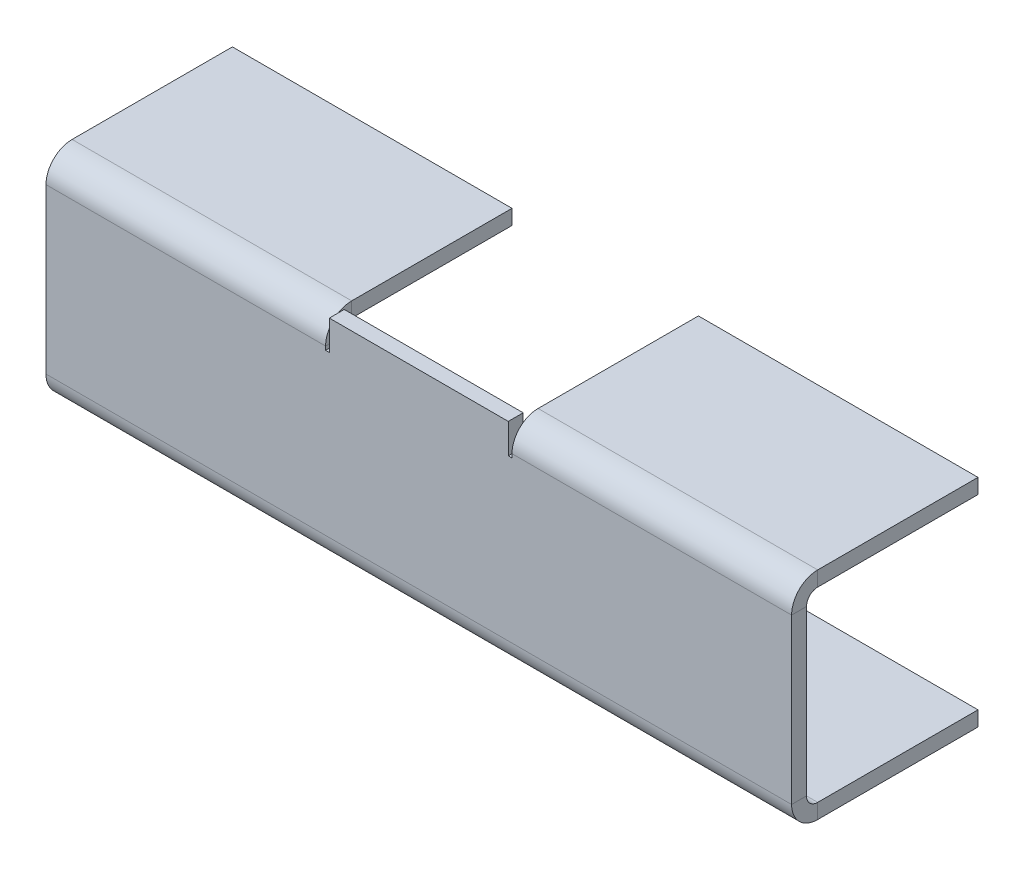
ISO-10303-21;
HEADER;
FILE_DESCRIPTION(('STEP AP214'),'2;1');
FILE_NAME('part.step','',(''),(''),'','','');
FILE_SCHEMA(('AUTOMOTIVE_DESIGN { 1 0 10303 214 1 1 1 1 }'));
ENDSEC;
DATA;
#1=APPLICATION_CONTEXT('core data for automotive mechanical design processes');
#2=APPLICATION_PROTOCOL_DEFINITION('international standard','automotive_design',2000,#1);
#3=PRODUCT_CONTEXT('',#1,'mechanical');
#4=PRODUCT('Part','Part','',(#3));
#5=PRODUCT_RELATED_PRODUCT_CATEGORY('part','',(#4));
#6=PRODUCT_DEFINITION_FORMATION('','',#4);
#7=PRODUCT_DEFINITION_CONTEXT('part definition',#1,'design');
#8=PRODUCT_DEFINITION('design','',#6,#7);
#9=PRODUCT_DEFINITION_SHAPE('','',#8);
#10=(LENGTH_UNIT() NAMED_UNIT(*) SI_UNIT(.MILLI.,.METRE.));
#11=(NAMED_UNIT(*) PLANE_ANGLE_UNIT() SI_UNIT($,.RADIAN.));
#12=(NAMED_UNIT(*) SI_UNIT($,.STERADIAN.) SOLID_ANGLE_UNIT());
#13=UNCERTAINTY_MEASURE_WITH_UNIT(LENGTH_MEASURE(1.E-05),#10,'distance_accuracy_value','');
#14=(GEOMETRIC_REPRESENTATION_CONTEXT(3) GLOBAL_UNCERTAINTY_ASSIGNED_CONTEXT((#13)) GLOBAL_UNIT_ASSIGNED_CONTEXT((#10,
#11,#12)) REPRESENTATION_CONTEXT('',''));
#15=CARTESIAN_POINT('',(0.,0.,0.));
#16=DIRECTION('',(0.,0.,1.));
#17=DIRECTION('',(1.,0.,0.));
#18=AXIS2_PLACEMENT_3D('',#15,#16,#17);
#19=CARTESIAN_POINT('',(0.,10.5,0.));
#20=DIRECTION('',(0.,1.,0.));
#21=DIRECTION('',(0.,0.,1.));
#22=AXIS2_PLACEMENT_3D('',#19,#20,#21);
#23=PLANE('',#22);
#24=DIRECTION('',(0.,0.,1.));
#25=VECTOR('',#24,1.);
#26=CARTESIAN_POINT('',(-12.,10.5,-2.));
#27=LINE('',#26,#25);
#28=CARTESIAN_POINT('',(-12.,10.5,-2.));
#29=VERTEX_POINT('',#28);
#30=CARTESIAN_POINT('',(-12.,10.5,0.));
#31=VERTEX_POINT('',#30);
#32=EDGE_CURVE('E60',#29,#31,#27,.T.);
#33=ORIENTED_EDGE('',*,*,#32,.F.);
#34=DIRECTION('',(1.,0.,0.));
#35=VECTOR('',#34,1.);
#36=CARTESIAN_POINT('',(0.,10.5,-2.));
#37=LINE('',#36,#35);
#38=CARTESIAN_POINT('',(-12.5,10.5,-2.));
#39=VERTEX_POINT('',#38);
#40=EDGE_CURVE('E274',#39,#29,#37,.T.);
#41=ORIENTED_EDGE('',*,*,#40,.F.);
#42=DIRECTION('',(0.,0.,1.));
#43=VECTOR('',#42,1.);
#44=CARTESIAN_POINT('',(-12.5,10.5000000000001,-25.));
#45=LINE('',#44,#43);
#46=CARTESIAN_POINT('',(-12.5,10.5,0.));
#47=VERTEX_POINT('',#46);
#48=EDGE_CURVE('E239',#39,#47,#45,.T.);
#49=ORIENTED_EDGE('',*,*,#48,.T.);
#50=DIRECTION('',(1.,0.,0.));
#51=VECTOR('',#50,1.);
#52=CARTESIAN_POINT('',(-12.5,10.5,0.));
#53=LINE('',#52,#51);
#54=EDGE_CURVE('E234',#47,#31,#53,.T.);
#55=ORIENTED_EDGE('',*,*,#54,.T.);
#56=EDGE_LOOP('',(#33,#41,#49,#55));
#57=FACE_BOUND('',#56,.T.);
#58=ADVANCED_FACE('F37',(#57),#23,.T.);
#59=CARTESIAN_POINT('',(12.5,10.5,0.));
#60=DIRECTION('',(1.,0.,0.));
#61=DIRECTION('',(0.,1.,0.));
#62=AXIS2_PLACEMENT_3D('',#59,#60,#61);
#63=PLANE('',#62);
#64=DIRECTION('',(0.,0.,1.));
#65=VECTOR('',#64,1.);
#66=CARTESIAN_POINT('',(12.5,12.5,0.));
#67=LINE('',#66,#65);
#68=CARTESIAN_POINT('',(12.5,12.5000000000001,-25.));
#69=VERTEX_POINT('',#68);
#70=CARTESIAN_POINT('',(12.5,12.5,-3.49999999999999));
#71=VERTEX_POINT('',#70);
#72=EDGE_CURVE('E249',#69,#71,#67,.T.);
#73=ORIENTED_EDGE('',*,*,#72,.T.);
#74=DIRECTION('',(0.,1.,0.));
#75=VECTOR('',#74,1.);
#76=CARTESIAN_POINT('',(12.5,12.5,-3.49999999999999));
#77=LINE('',#76,#75);
#78=CARTESIAN_POINT('',(12.5,14.5,-3.49999999999999));
#79=VERTEX_POINT('',#78);
#80=EDGE_CURVE('E11',#71,#79,#77,.T.);
#81=ORIENTED_EDGE('',*,*,#80,.T.);
#82=DIRECTION('',(0.,0.,-1.));
#83=VECTOR('',#82,1.);
#84=CARTESIAN_POINT('',(12.5,14.5,0.));
#85=LINE('',#84,#83);
#86=CARTESIAN_POINT('',(12.5,14.5000000000001,-25.));
#87=VERTEX_POINT('',#86);
#88=EDGE_CURVE('E231',#79,#87,#85,.T.);
#89=ORIENTED_EDGE('',*,*,#88,.T.);
#90=DIRECTION('',(0.,1.,0.));
#91=VECTOR('',#90,1.);
#92=CARTESIAN_POINT('',(12.5,14.5000000000001,-25.));
#93=LINE('',#92,#91);
#94=EDGE_CURVE('E399',#69,#87,#93,.T.);
#95=ORIENTED_EDGE('',*,*,#94,.F.);
#96=EDGE_LOOP('',(#73,#81,#89,#95));
#97=FACE_BOUND('',#96,.T.);
#98=ADVANCED_FACE('F496',(#97),#63,.F.);
#99=DIRECTION('',(0.,1.,0.));
#100=VECTOR('',#99,1.);
#101=CARTESIAN_POINT('',(12.5,10.5,0.));
#102=LINE('',#101,#100);
#103=CARTESIAN_POINT('',(12.5,10.5,0.));
#104=VERTEX_POINT('',#103);
#105=CARTESIAN_POINT('',(12.5,11.,0.));
#106=VERTEX_POINT('',#105);
#107=EDGE_CURVE('E241',#104,#106,#102,.T.);
#108=ORIENTED_EDGE('',*,*,#107,.T.);
#109=DIRECTION('',(0.,0.,-1.));
#110=VECTOR('',#109,1.);
#111=CARTESIAN_POINT('',(12.5,11.,0.));
#112=LINE('',#111,#110);
#113=CARTESIAN_POINT('',(12.5,11.,-2.00000000000001));
#114=VERTEX_POINT('',#113);
#115=EDGE_CURVE('E45',#106,#114,#112,.T.);
#116=ORIENTED_EDGE('',*,*,#115,.T.);
#117=DIRECTION('',(0.,-1.,0.));
#118=VECTOR('',#117,1.);
#119=CARTESIAN_POINT('',(12.5,0.,-2.));
#120=LINE('',#119,#118);
#121=CARTESIAN_POINT('',(12.5,10.5,-2.));
#122=VERTEX_POINT('',#121);
#123=EDGE_CURVE('E257',#114,#122,#120,.T.);
#124=ORIENTED_EDGE('',*,*,#123,.T.);
#125=DIRECTION('',(0.,0.,-1.));
#126=VECTOR('',#125,1.);
#127=CARTESIAN_POINT('',(12.5,10.5,0.));
#128=LINE('',#127,#126);
#129=EDGE_CURVE('E236',#104,#122,#128,.T.);
#130=ORIENTED_EDGE('',*,*,#129,.F.);
#131=EDGE_LOOP('',(#108,#116,#124,#130));
#132=FACE_BOUND('',#131,.T.);
#133=ADVANCED_FACE('F413',(#132),#63,.F.);
#134=CARTESIAN_POINT('',(-12.5,10.5000000000001,-25.));
#135=DIRECTION('',(-1.,0.,0.));
#136=DIRECTION('',(0.,-1.,0.));
#137=AXIS2_PLACEMENT_3D('',#134,#135,#136);
#138=PLANE('',#137);
#139=DIRECTION('',(0.,1.,0.));
#140=VECTOR('',#139,1.);
#141=CARTESIAN_POINT('',(-12.5,0.,-2.));
#142=LINE('',#141,#140);
#143=CARTESIAN_POINT('',(-12.5,11.,-2.00000000000001));
#144=VERTEX_POINT('',#143);
#145=EDGE_CURVE('E268',#39,#144,#142,.T.);
#146=ORIENTED_EDGE('',*,*,#145,.T.);
#147=DIRECTION('',(0.,0.,1.));
#148=VECTOR('',#147,1.);
#149=CARTESIAN_POINT('',(-12.5,11.,-2.00000000000001));
#150=LINE('',#149,#148);
#151=CARTESIAN_POINT('',(-12.5,11.,0.));
#152=VERTEX_POINT('',#151);
#153=EDGE_CURVE('E410',#144,#152,#150,.T.);
#154=ORIENTED_EDGE('',*,*,#153,.T.);
#155=DIRECTION('',(0.,1.,0.));
#156=VECTOR('',#155,1.);
#157=CARTESIAN_POINT('',(-12.5,10.5,0.));
#158=LINE('',#157,#156);
#159=EDGE_CURVE('E246',#47,#152,#158,.T.);
#160=ORIENTED_EDGE('',*,*,#159,.F.);
#161=ORIENTED_EDGE('',*,*,#48,.F.);
#162=EDGE_LOOP('',(#146,#154,#160,#161));
#163=FACE_BOUND('',#162,.T.);
#164=ADVANCED_FACE('F518',(#163),#138,.F.);
#165=DIRECTION('',(0.,0.,1.));
#166=VECTOR('',#165,1.);
#167=CARTESIAN_POINT('',(-12.5,14.5000000000001,-25.));
#168=LINE('',#167,#166);
#169=CARTESIAN_POINT('',(-12.5,14.5000000000001,-25.));
#170=VERTEX_POINT('',#169);
#171=CARTESIAN_POINT('',(-12.5,14.5,-3.49999999999999));
#172=VERTEX_POINT('',#171);
#173=EDGE_CURVE('E243',#170,#172,#168,.T.);
#174=ORIENTED_EDGE('',*,*,#173,.T.);
#175=DIRECTION('',(0.,-1.,0.));
#176=VECTOR('',#175,1.);
#177=CARTESIAN_POINT('',(-12.5,14.5,-3.49999999999999));
#178=LINE('',#177,#176);
#179=CARTESIAN_POINT('',(-12.5,12.5,-3.49999999999999));
#180=VERTEX_POINT('',#179);
#181=EDGE_CURVE('E408',#172,#180,#178,.T.);
#182=ORIENTED_EDGE('',*,*,#181,.T.);
#183=DIRECTION('',(0.,0.,-1.));
#184=VECTOR('',#183,1.);
#185=CARTESIAN_POINT('',(-12.5,12.5,0.));
#186=LINE('',#185,#184);
#187=CARTESIAN_POINT('',(-12.5,12.5000000000001,-25.));
#188=VERTEX_POINT('',#187);
#189=EDGE_CURVE('E263',#180,#188,#186,.T.);
#190=ORIENTED_EDGE('',*,*,#189,.T.);
#191=DIRECTION('',(0.,-1.,0.));
#192=VECTOR('',#191,1.);
#193=CARTESIAN_POINT('',(-12.5,14.5000000000001,-25.));
#194=LINE('',#193,#192);
#195=EDGE_CURVE('E405',#170,#188,#194,.T.);
#196=ORIENTED_EDGE('',*,*,#195,.F.);
#197=EDGE_LOOP('',(#174,#182,#190,#196));
#198=FACE_BOUND('',#197,.T.);
#199=ADVANCED_FACE('F548',(#198),#138,.F.);
#200=CARTESIAN_POINT('',(50.,11.,-3.5));
#201=DIRECTION('',(1.,0.,0.));
#202=DIRECTION('',(0.,1.,0.));
#203=AXIS2_PLACEMENT_3D('',#200,#201,#202);
#204=CYLINDRICAL_SURFACE('',#203,3.49999999999999);
#205=CARTESIAN_POINT('',(-12.5,11.,-3.5));
#206=DIRECTION('',(-1.,0.,0.));
#207=DIRECTION('',(0.,-1.,0.));
#208=AXIS2_PLACEMENT_3D('',#205,#206,#207);
#209=CIRCLE('',#208,3.49999999999999);
#210=EDGE_CURVE('E271',#172,#152,#209,.F.);
#211=ORIENTED_EDGE('',*,*,#210,.F.);
#212=DIRECTION('',(-1.,0.,0.));
#213=VECTOR('',#212,1.);
#214=CARTESIAN_POINT('',(0.,14.5,-3.49999999999999));
#215=LINE('',#214,#213);
#216=CARTESIAN_POINT('',(-50.,14.5,-3.49999999999999));
#217=VERTEX_POINT('',#216);
#218=EDGE_CURVE('E337',#172,#217,#215,.T.);
#219=ORIENTED_EDGE('',*,*,#218,.T.);
#220=CARTESIAN_POINT('',(-50.,11.,-3.5));
#221=DIRECTION('',(1.,0.,0.));
#222=DIRECTION('',(0.,0.,-1.));
#223=AXIS2_PLACEMENT_3D('',#220,#221,#222);
#224=CIRCLE('',#223,3.49999999999999);
#225=CARTESIAN_POINT('',(-50.,11.,0.));
#226=VERTEX_POINT('',#225);
#227=EDGE_CURVE('E371',#226,#217,#224,.F.);
#228=ORIENTED_EDGE('',*,*,#227,.F.);
#229=DIRECTION('',(1.,0.,0.));
#230=VECTOR('',#229,1.);
#231=CARTESIAN_POINT('',(50.,11.,0.));
#232=LINE('',#231,#230);
#233=EDGE_CURVE('E372',#152,#226,#232,.F.);
#234=ORIENTED_EDGE('',*,*,#233,.F.);
#235=EDGE_LOOP('',(#211,#219,#228,#234));
#236=FACE_BOUND('',#235,.T.);
#237=ADVANCED_FACE('F524',(#236),#204,.T.);
#238=CARTESIAN_POINT('',(50.,11.,-3.5));
#239=DIRECTION('',(1.,0.,0.));
#240=DIRECTION('',(0.,1.,0.));
#241=AXIS2_PLACEMENT_3D('',#238,#239,#240);
#242=CYLINDRICAL_SURFACE('',#241,1.49999999999999);
#243=DIRECTION('',(1.,0.,0.));
#244=VECTOR('',#243,1.);
#245=CARTESIAN_POINT('',(-50.,12.5,-3.49999999999999));
#246=LINE('',#245,#244);
#247=CARTESIAN_POINT('',(-50.,12.5,-3.49999999999999));
#248=VERTEX_POINT('',#247);
#249=EDGE_CURVE('E330',#248,#180,#246,.T.);
#250=ORIENTED_EDGE('',*,*,#249,.T.);
#251=CARTESIAN_POINT('',(-12.5,11.,-3.5));
#252=DIRECTION('',(-1.,0.,0.));
#253=DIRECTION('',(0.,-1.,0.));
#254=AXIS2_PLACEMENT_3D('',#251,#252,#253);
#255=CIRCLE('',#254,1.49999999999999);
#256=EDGE_CURVE('E265',#180,#144,#255,.F.);
#257=ORIENTED_EDGE('',*,*,#256,.T.);
#258=DIRECTION('',(1.,0.,0.));
#259=VECTOR('',#258,1.);
#260=CARTESIAN_POINT('',(50.,11.,-2.00000000000001));
#261=LINE('',#260,#259);
#262=CARTESIAN_POINT('',(-50.,11.,-2.));
#263=VERTEX_POINT('',#262);
#264=EDGE_CURVE('E385',#144,#263,#261,.F.);
#265=ORIENTED_EDGE('',*,*,#264,.T.);
#266=CARTESIAN_POINT('',(-50.,11.,-3.5));
#267=DIRECTION('',(1.,0.,0.));
#268=DIRECTION('',(0.,0.,-1.));
#269=AXIS2_PLACEMENT_3D('',#266,#267,#268);
#270=CIRCLE('',#269,1.49999999999999);
#271=EDGE_CURVE('E379',#263,#248,#270,.F.);
#272=ORIENTED_EDGE('',*,*,#271,.T.);
#273=EDGE_LOOP('',(#250,#257,#265,#272));
#274=FACE_BOUND('',#273,.T.);
#275=ADVANCED_FACE('F540',(#274),#242,.F.);
#276=CARTESIAN_POINT('',(0.,14.5,0.));
#277=DIRECTION('',(0.,-1.,0.));
#278=DIRECTION('',(0.,0.,-1.));
#279=AXIS2_PLACEMENT_3D('',#276,#277,#278);
#280=PLANE('',#279);
#281=ORIENTED_EDGE('',*,*,#218,.F.);
#282=ORIENTED_EDGE('',*,*,#173,.F.);
#283=DIRECTION('',(-1.,0.,0.));
#284=VECTOR('',#283,1.);
#285=CARTESIAN_POINT('',(-50.,14.5000000000001,-25.));
#286=LINE('',#285,#284);
#287=CARTESIAN_POINT('',(-50.,14.5000000000001,-25.));
#288=VERTEX_POINT('',#287);
#289=EDGE_CURVE('E346',#170,#288,#286,.T.);
#290=ORIENTED_EDGE('',*,*,#289,.T.);
#291=DIRECTION('',(0.,0.,1.));
#292=VECTOR('',#291,1.);
#293=CARTESIAN_POINT('',(-50.,14.5,-1.99999999999999));
#294=LINE('',#293,#292);
#295=EDGE_CURVE('E351',#288,#217,#294,.T.);
#296=ORIENTED_EDGE('',*,*,#295,.T.);
#297=EDGE_LOOP('',(#281,#282,#290,#296));
#298=FACE_BOUND('',#297,.T.);
#299=ADVANCED_FACE('F528',(#298),#280,.F.);
#300=CARTESIAN_POINT('',(0.,12.5,0.));
#301=DIRECTION('',(0.,-1.,0.));
#302=DIRECTION('',(0.,0.,-1.));
#303=AXIS2_PLACEMENT_3D('',#300,#301,#302);
#304=PLANE('',#303);
#305=ORIENTED_EDGE('',*,*,#189,.F.);
#306=ORIENTED_EDGE('',*,*,#249,.F.);
#307=DIRECTION('',(0.,0.,1.));
#308=VECTOR('',#307,1.);
#309=CARTESIAN_POINT('',(-50.,12.5,-2.));
#310=LINE('',#309,#308);
#311=CARTESIAN_POINT('',(-50.,12.5000000000001,-25.));
#312=VERTEX_POINT('',#311);
#313=EDGE_CURVE('E347',#312,#248,#310,.T.);
#314=ORIENTED_EDGE('',*,*,#313,.F.);
#315=DIRECTION('',(-1.,0.,0.));
#316=VECTOR('',#315,1.);
#317=CARTESIAN_POINT('',(-50.,12.5000000000001,-25.));
#318=LINE('',#317,#316);
#319=EDGE_CURVE('E356',#188,#312,#318,.T.);
#320=ORIENTED_EDGE('',*,*,#319,.F.);
#321=EDGE_LOOP('',(#305,#306,#314,#320));
#322=FACE_BOUND('',#321,.T.);
#323=ADVANCED_FACE('F545',(#322),#304,.T.);
#324=CARTESIAN_POINT('',(-50.,14.5000000000001,-25.));
#325=DIRECTION('',(0.,0.,1.));
#326=DIRECTION('',(0.,-1.,0.));
#327=AXIS2_PLACEMENT_3D('',#324,#325,#326);
#328=PLANE('',#327);
#329=ORIENTED_EDGE('',*,*,#289,.F.);
#330=ORIENTED_EDGE('',*,*,#195,.T.);
#331=ORIENTED_EDGE('',*,*,#319,.T.);
#332=DIRECTION('',(0.,-1.,0.));
#333=VECTOR('',#332,1.);
#334=CARTESIAN_POINT('',(-50.,14.5000000000001,-25.));
#335=LINE('',#334,#333);
#336=EDGE_CURVE('E354',#288,#312,#335,.T.);
#337=ORIENTED_EDGE('',*,*,#336,.F.);
#338=EDGE_LOOP('',(#329,#330,#331,#337));
#339=FACE_BOUND('',#338,.T.);
#340=ADVANCED_FACE('F550',(#339),#328,.F.);
#341=CARTESIAN_POINT('',(0.,0.,-2.));
#342=DIRECTION('',(0.,0.,-1.));
#343=DIRECTION('',(-1.,0.,0.));
#344=AXIS2_PLACEMENT_3D('',#341,#342,#343);
#345=PLANE('',#344);
#346=ORIENTED_EDGE('',*,*,#145,.F.);
#347=ORIENTED_EDGE('',*,*,#40,.T.);
#348=DIRECTION('',(0.,-1.,0.));
#349=VECTOR('',#348,1.);
#350=CARTESIAN_POINT('',(-12.,10.5,-2.));
#351=LINE('',#350,#349);
#352=CARTESIAN_POINT('',(-12.,14.5,-2.));
#353=VERTEX_POINT('',#352);
#354=EDGE_CURVE('E215',#353,#29,#351,.T.);
#355=ORIENTED_EDGE('',*,*,#354,.F.);
#356=DIRECTION('',(-1.,0.,0.));
#357=VECTOR('',#356,1.);
#358=CARTESIAN_POINT('',(-12.,14.5,-2.));
#359=LINE('',#358,#357);
#360=CARTESIAN_POINT('',(12.,14.5,-2.));
#361=VERTEX_POINT('',#360);
#362=EDGE_CURVE('E202',#361,#353,#359,.T.);
#363=ORIENTED_EDGE('',*,*,#362,.F.);
#364=DIRECTION('',(0.,1.,0.));
#365=VECTOR('',#364,1.);
#366=CARTESIAN_POINT('',(12.,10.5,-2.));
#367=LINE('',#366,#365);
#368=CARTESIAN_POINT('',(12.,10.5,-2.));
#369=VERTEX_POINT('',#368);
#370=EDGE_CURVE('E212',#369,#361,#367,.T.);
#371=ORIENTED_EDGE('',*,*,#370,.F.);
#372=EDGE_CURVE('E52',#369,#122,#37,.T.);
#373=ORIENTED_EDGE('',*,*,#372,.T.);
#374=ORIENTED_EDGE('',*,*,#123,.F.);
#375=CARTESIAN_POINT('',(50.,11.,-2.));
#376=VERTEX_POINT('',#375);
#377=EDGE_CURVE('E382',#376,#114,#261,.F.);
#378=ORIENTED_EDGE('',*,*,#377,.F.);
#379=DIRECTION('',(0.,1.,0.));
#380=VECTOR('',#379,1.);
#381=CARTESIAN_POINT('',(50.,-12.5,-2.));
#382=LINE('',#381,#380);
#383=CARTESIAN_POINT('',(50.,-11.,-2.00000000000001));
#384=VERTEX_POINT('',#383);
#385=EDGE_CURVE('E393',#384,#376,#382,.T.);
#386=ORIENTED_EDGE('',*,*,#385,.F.);
#387=DIRECTION('',(-1.,0.,0.));
#388=VECTOR('',#387,1.);
#389=CARTESIAN_POINT('',(-50.,-11.,-2.00000000000001));
#390=LINE('',#389,#388);
#391=CARTESIAN_POINT('',(-50.,-11.,-2.00000000000001));
#392=VERTEX_POINT('',#391);
#393=EDGE_CURVE('E319',#392,#384,#390,.F.);
#394=ORIENTED_EDGE('',*,*,#393,.F.);
#395=DIRECTION('',(0.,-1.,0.));
#396=VECTOR('',#395,1.);
#397=CARTESIAN_POINT('',(-50.,-12.5,-2.));
#398=LINE('',#397,#396);
#399=EDGE_CURVE('E395',#263,#392,#398,.T.);
#400=ORIENTED_EDGE('',*,*,#399,.F.);
#401=ORIENTED_EDGE('',*,*,#264,.F.);
#402=EDGE_LOOP('',(#346,#347,#355,#363,#371,#373,#374,#378,#386,#394,#400,#401));
#403=FACE_BOUND('',#402,.T.);
#404=ADVANCED_FACE('F219',(#403),#345,.T.);
#405=CARTESIAN_POINT('',(0.,0.,0.));
#406=DIRECTION('',(0.,0.,-1.));
#407=DIRECTION('',(-1.,0.,0.));
#408=AXIS2_PLACEMENT_3D('',#405,#406,#407);
#409=PLANE('',#408);
#410=ORIENTED_EDGE('',*,*,#54,.F.);
#411=ORIENTED_EDGE('',*,*,#159,.T.);
#412=ORIENTED_EDGE('',*,*,#233,.T.);
#413=DIRECTION('',(0.,-1.,0.));
#414=VECTOR('',#413,1.);
#415=CARTESIAN_POINT('',(-50.,-12.5,0.));
#416=LINE('',#415,#414);
#417=CARTESIAN_POINT('',(-50.,-11.,0.));
#418=VERTEX_POINT('',#417);
#419=EDGE_CURVE('E396',#226,#418,#416,.T.);
#420=ORIENTED_EDGE('',*,*,#419,.T.);
#421=DIRECTION('',(-1.,0.,0.));
#422=VECTOR('',#421,1.);
#423=CARTESIAN_POINT('',(-50.,-11.,0.));
#424=LINE('',#423,#422);
#425=CARTESIAN_POINT('',(50.,-11.,0.));
#426=VERTEX_POINT('',#425);
#427=EDGE_CURVE('E307',#418,#426,#424,.F.);
#428=ORIENTED_EDGE('',*,*,#427,.T.);
#429=DIRECTION('',(0.,1.,0.));
#430=VECTOR('',#429,1.);
#431=CARTESIAN_POINT('',(50.,-12.5,0.));
#432=LINE('',#431,#430);
#433=CARTESIAN_POINT('',(50.,11.,0.));
#434=VERTEX_POINT('',#433);
#435=EDGE_CURVE('E391',#426,#434,#432,.T.);
#436=ORIENTED_EDGE('',*,*,#435,.T.);
#437=EDGE_CURVE('E368',#434,#106,#232,.F.);
#438=ORIENTED_EDGE('',*,*,#437,.T.);
#439=ORIENTED_EDGE('',*,*,#107,.F.);
#440=CARTESIAN_POINT('',(12.,10.5,0.));
#441=VERTEX_POINT('',#440);
#442=EDGE_CURVE('E237',#441,#104,#53,.T.);
#443=ORIENTED_EDGE('',*,*,#442,.F.);
#444=DIRECTION('',(0.,1.,0.));
#445=VECTOR('',#444,1.);
#446=CARTESIAN_POINT('',(12.,10.5,0.));
#447=LINE('',#446,#445);
#448=CARTESIAN_POINT('',(12.,14.5,0.));
#449=VERTEX_POINT('',#448);
#450=EDGE_CURVE('E228',#441,#449,#447,.T.);
#451=ORIENTED_EDGE('',*,*,#450,.T.);
#452=DIRECTION('',(-1.,0.,0.));
#453=VECTOR('',#452,1.);
#454=CARTESIAN_POINT('',(-12.,14.5,0.));
#455=LINE('',#454,#453);
#456=CARTESIAN_POINT('',(-12.,14.5,0.));
#457=VERTEX_POINT('',#456);
#458=EDGE_CURVE('E204',#449,#457,#455,.T.);
#459=ORIENTED_EDGE('',*,*,#458,.T.);
#460=DIRECTION('',(0.,-1.,0.));
#461=VECTOR('',#460,1.);
#462=CARTESIAN_POINT('',(-12.,10.5,0.));
#463=LINE('',#462,#461);
#464=EDGE_CURVE('E225',#457,#31,#463,.T.);
#465=ORIENTED_EDGE('',*,*,#464,.T.);
#466=EDGE_LOOP('',(#410,#411,#412,#420,#428,#436,#438,#439,#443,#451,#459,#465));
#467=FACE_BOUND('',#466,.T.);
#468=ADVANCED_FACE('F451',(#467),#409,.F.);
#469=CARTESIAN_POINT('',(-50.,-12.5,-2.));
#470=DIRECTION('',(-1.,0.,0.));
#471=DIRECTION('',(0.,0.,1.));
#472=AXIS2_PLACEMENT_3D('',#469,#470,#471);
#473=PLANE('',#472);
#474=ORIENTED_EDGE('',*,*,#399,.T.);
#475=DIRECTION('',(0.,0.,1.));
#476=VECTOR('',#475,1.);
#477=CARTESIAN_POINT('',(-50.,-11.,-2.00000000000001));
#478=LINE('',#477,#476);
#479=EDGE_CURVE('E313',#392,#418,#478,.T.);
#480=ORIENTED_EDGE('',*,*,#479,.T.);
#481=ORIENTED_EDGE('',*,*,#419,.F.);
#482=DIRECTION('',(0.,0.,1.));
#483=VECTOR('',#482,1.);
#484=CARTESIAN_POINT('',(-50.,11.,-2.00000000000001));
#485=LINE('',#484,#483);
#486=EDGE_CURVE('E388',#263,#226,#485,.T.);
#487=ORIENTED_EDGE('',*,*,#486,.F.);
#488=EDGE_LOOP('',(#474,#480,#481,#487));
#489=FACE_BOUND('',#488,.T.);
#490=ADVANCED_FACE('F589',(#489),#473,.T.);
#491=CARTESIAN_POINT('',(50.,-12.5,-2.));
#492=DIRECTION('',(1.,0.,0.));
#493=DIRECTION('',(0.,0.,-1.));
#494=AXIS2_PLACEMENT_3D('',#491,#492,#493);
#495=PLANE('',#494);
#496=DIRECTION('',(0.,0.,1.));
#497=VECTOR('',#496,1.);
#498=CARTESIAN_POINT('',(50.,-11.,-2.00000000000001));
#499=LINE('',#498,#497);
#500=EDGE_CURVE('E324',#384,#426,#499,.T.);
#501=ORIENTED_EDGE('',*,*,#500,.F.);
#502=ORIENTED_EDGE('',*,*,#385,.T.);
#503=DIRECTION('',(0.,0.,1.));
#504=VECTOR('',#503,1.);
#505=CARTESIAN_POINT('',(50.,11.,-2.00000000000001));
#506=LINE('',#505,#504);
#507=EDGE_CURVE('E375',#376,#434,#506,.T.);
#508=ORIENTED_EDGE('',*,*,#507,.T.);
#509=ORIENTED_EDGE('',*,*,#435,.F.);
#510=EDGE_LOOP('',(#501,#502,#508,#509));
#511=FACE_BOUND('',#510,.T.);
#512=ADVANCED_FACE('F39',(#511),#495,.T.);
#513=CARTESIAN_POINT('',(-50.,11.,-3.5));
#514=DIRECTION('',(-1.,0.,0.));
#515=DIRECTION('',(0.,0.,1.));
#516=AXIS2_PLACEMENT_3D('',#513,#514,#515);
#517=PLANE('',#516);
#518=DIRECTION('',(0.,1.,0.));
#519=VECTOR('',#518,1.);
#520=CARTESIAN_POINT('',(-50.,12.5,-3.49999999999999));
#521=LINE('',#520,#519);
#522=EDGE_CURVE('E327',#248,#217,#521,.T.);
#523=ORIENTED_EDGE('',*,*,#522,.F.);
#524=ORIENTED_EDGE('',*,*,#271,.F.);
#525=ORIENTED_EDGE('',*,*,#486,.T.);
#526=ORIENTED_EDGE('',*,*,#227,.T.);
#527=EDGE_LOOP('',(#523,#524,#525,#526));
#528=FACE_BOUND('',#527,.T.);
#529=ADVANCED_FACE('F537',(#528),#517,.T.);
#530=CARTESIAN_POINT('',(50.,11.,-3.5));
#531=DIRECTION('',(-1.,0.,0.));
#532=DIRECTION('',(0.,0.,1.));
#533=AXIS2_PLACEMENT_3D('',#530,#531,#532);
#534=PLANE('',#533);
#535=CARTESIAN_POINT('',(50.,11.,-3.5));
#536=DIRECTION('',(1.,0.,0.));
#537=DIRECTION('',(0.,0.,-1.));
#538=AXIS2_PLACEMENT_3D('',#535,#536,#537);
#539=CIRCLE('',#538,1.49999999999999);
#540=CARTESIAN_POINT('',(50.,12.5,-3.49999999999999));
#541=VERTEX_POINT('',#540);
#542=EDGE_CURVE('E367',#541,#376,#539,.T.);
#543=ORIENTED_EDGE('',*,*,#542,.F.);
#544=DIRECTION('',(0.,1.,0.));
#545=VECTOR('',#544,1.);
#546=CARTESIAN_POINT('',(50.,12.5,-3.49999999999999));
#547=LINE('',#546,#545);
#548=CARTESIAN_POINT('',(50.,14.5,-3.49999999999999));
#549=VERTEX_POINT('',#548);
#550=EDGE_CURVE('E333',#541,#549,#547,.T.);
#551=ORIENTED_EDGE('',*,*,#550,.T.);
#552=CARTESIAN_POINT('',(50.,11.,-3.5));
#553=DIRECTION('',(1.,0.,0.));
#554=DIRECTION('',(0.,0.,-1.));
#555=AXIS2_PLACEMENT_3D('',#552,#553,#554);
#556=CIRCLE('',#555,3.49999999999999);
#557=EDGE_CURVE('E376',#549,#434,#556,.T.);
#558=ORIENTED_EDGE('',*,*,#557,.T.);
#559=ORIENTED_EDGE('',*,*,#507,.F.);
#560=EDGE_LOOP('',(#543,#551,#558,#559));
#561=FACE_BOUND('',#560,.T.);
#562=ADVANCED_FACE('F429',(#561),#534,.F.);
#563=CARTESIAN_POINT('',(12.5,11.,-3.5));
#564=DIRECTION('',(1.,0.,0.));
#565=DIRECTION('',(0.,1.,0.));
#566=AXIS2_PLACEMENT_3D('',#563,#564,#565);
#567=CIRCLE('',#566,3.49999999999999);
#568=EDGE_CURVE('E260',#106,#79,#567,.F.);
#569=ORIENTED_EDGE('',*,*,#568,.F.);
#570=ORIENTED_EDGE('',*,*,#437,.F.);
#571=ORIENTED_EDGE('',*,*,#557,.F.);
#572=EDGE_CURVE('E340',#549,#79,#215,.T.);
#573=ORIENTED_EDGE('',*,*,#572,.T.);
#574=EDGE_LOOP('',(#569,#570,#571,#573));
#575=FACE_BOUND('',#574,.T.);
#576=ADVANCED_FACE('F447',(#575),#204,.T.);
#577=ORIENTED_EDGE('',*,*,#377,.T.);
#578=CARTESIAN_POINT('',(12.5,11.,-3.5));
#579=DIRECTION('',(1.,0.,0.));
#580=DIRECTION('',(0.,1.,0.));
#581=AXIS2_PLACEMENT_3D('',#578,#579,#580);
#582=CIRCLE('',#581,1.49999999999999);
#583=EDGE_CURVE('E254',#114,#71,#582,.F.);
#584=ORIENTED_EDGE('',*,*,#583,.T.);
#585=EDGE_CURVE('E334',#71,#541,#246,.T.);
#586=ORIENTED_EDGE('',*,*,#585,.T.);
#587=ORIENTED_EDGE('',*,*,#542,.T.);
#588=EDGE_LOOP('',(#577,#584,#586,#587));
#589=FACE_BOUND('',#588,.T.);
#590=ADVANCED_FACE('F425',(#589),#242,.F.);
#591=CARTESIAN_POINT('',(50.,14.5000000000001,-25.));
#592=DIRECTION('',(-1.,0.,0.));
#593=DIRECTION('',(0.,-1.,0.));
#594=AXIS2_PLACEMENT_3D('',#591,#592,#593);
#595=PLANE('',#594);
#596=ORIENTED_EDGE('',*,*,#550,.F.);
#597=DIRECTION('',(0.,0.,-1.));
#598=VECTOR('',#597,1.);
#599=CARTESIAN_POINT('',(50.,12.5000000000001,-25.));
#600=LINE('',#599,#598);
#601=CARTESIAN_POINT('',(50.,12.5000000000001,-25.));
#602=VERTEX_POINT('',#601);
#603=EDGE_CURVE('E343',#541,#602,#600,.T.);
#604=ORIENTED_EDGE('',*,*,#603,.T.);
#605=DIRECTION('',(0.,-1.,0.));
#606=VECTOR('',#605,1.);
#607=CARTESIAN_POINT('',(50.,14.5000000000001,-25.));
#608=LINE('',#607,#606);
#609=CARTESIAN_POINT('',(50.,14.5000000000001,-25.));
#610=VERTEX_POINT('',#609);
#611=EDGE_CURVE('E364',#610,#602,#608,.T.);
#612=ORIENTED_EDGE('',*,*,#611,.F.);
#613=DIRECTION('',(0.,0.,-1.));
#614=VECTOR('',#613,1.);
#615=CARTESIAN_POINT('',(50.,14.5000000000001,-25.));
#616=LINE('',#615,#614);
#617=EDGE_CURVE('E344',#549,#610,#616,.T.);
#618=ORIENTED_EDGE('',*,*,#617,.F.);
#619=EDGE_LOOP('',(#596,#604,#612,#618));
#620=FACE_BOUND('',#619,.T.);
#621=ADVANCED_FACE('F434',(#620),#595,.F.);
#622=CARTESIAN_POINT('',(-50.,14.5,-1.99999999999999));
#623=DIRECTION('',(1.,0.,0.));
#624=DIRECTION('',(0.,1.,0.));
#625=AXIS2_PLACEMENT_3D('',#622,#623,#624);
#626=PLANE('',#625);
#627=ORIENTED_EDGE('',*,*,#522,.T.);
#628=ORIENTED_EDGE('',*,*,#295,.F.);
#629=ORIENTED_EDGE('',*,*,#336,.T.);
#630=ORIENTED_EDGE('',*,*,#313,.T.);
#631=EDGE_LOOP('',(#627,#628,#629,#630));
#632=FACE_BOUND('',#631,.T.);
#633=ADVANCED_FACE('F533',(#632),#626,.F.);
#634=EDGE_CURVE('E348',#610,#87,#286,.T.);
#635=ORIENTED_EDGE('',*,*,#634,.T.);
#636=ORIENTED_EDGE('',*,*,#88,.F.);
#637=ORIENTED_EDGE('',*,*,#572,.F.);
#638=ORIENTED_EDGE('',*,*,#617,.T.);
#639=EDGE_LOOP('',(#635,#636,#637,#638));
#640=FACE_BOUND('',#639,.T.);
#641=ADVANCED_FACE('F445',(#640),#280,.F.);
#642=ORIENTED_EDGE('',*,*,#72,.F.);
#643=EDGE_CURVE('E357',#602,#69,#318,.T.);
#644=ORIENTED_EDGE('',*,*,#643,.F.);
#645=ORIENTED_EDGE('',*,*,#603,.F.);
#646=ORIENTED_EDGE('',*,*,#585,.F.);
#647=EDGE_LOOP('',(#642,#644,#645,#646));
#648=FACE_BOUND('',#647,.T.);
#649=ADVANCED_FACE('F439',(#648),#304,.T.);
#650=ORIENTED_EDGE('',*,*,#643,.T.);
#651=ORIENTED_EDGE('',*,*,#94,.T.);
#652=ORIENTED_EDGE('',*,*,#634,.F.);
#653=ORIENTED_EDGE('',*,*,#611,.T.);
#654=EDGE_LOOP('',(#650,#651,#652,#653));
#655=FACE_BOUND('',#654,.T.);
#656=ADVANCED_FACE('F442',(#655),#328,.F.);
#657=CARTESIAN_POINT('',(50.,-11.,-3.5));
#658=DIRECTION('',(1.,0.,0.));
#659=DIRECTION('',(0.,0.,-1.));
#660=AXIS2_PLACEMENT_3D('',#657,#658,#659);
#661=PLANE('',#660);
#662=DIRECTION('',(0.,-1.,0.));
#663=VECTOR('',#662,1.);
#664=CARTESIAN_POINT('',(50.,-12.5,-3.49999999999999));
#665=LINE('',#664,#663);
#666=CARTESIAN_POINT('',(50.,-12.5,-3.49999999999999));
#667=VERTEX_POINT('',#666);
#668=CARTESIAN_POINT('',(50.,-14.5,-3.49999999999999));
#669=VERTEX_POINT('',#668);
#670=EDGE_CURVE('E276',#667,#669,#665,.T.);
#671=ORIENTED_EDGE('',*,*,#670,.F.);
#672=CARTESIAN_POINT('',(50.,-11.,-3.5));
#673=DIRECTION('',(-1.,0.,0.));
#674=DIRECTION('',(0.,0.,1.));
#675=AXIS2_PLACEMENT_3D('',#672,#673,#674);
#676=CIRCLE('',#675,1.49999999999999);
#677=EDGE_CURVE('E316',#384,#667,#676,.F.);
#678=ORIENTED_EDGE('',*,*,#677,.F.);
#679=ORIENTED_EDGE('',*,*,#500,.T.);
#680=CARTESIAN_POINT('',(50.,-11.,-3.5));
#681=DIRECTION('',(-1.,0.,0.));
#682=DIRECTION('',(0.,0.,1.));
#683=AXIS2_PLACEMENT_3D('',#680,#681,#682);
#684=CIRCLE('',#683,3.49999999999999);
#685=EDGE_CURVE('E309',#426,#669,#684,.F.);
#686=ORIENTED_EDGE('',*,*,#685,.T.);
#687=EDGE_LOOP('',(#671,#678,#679,#686));
#688=FACE_BOUND('',#687,.T.);
#689=ADVANCED_FACE('F458',(#688),#661,.T.);
#690=CARTESIAN_POINT('',(-50.,-11.,-3.5));
#691=DIRECTION('',(1.,0.,0.));
#692=DIRECTION('',(0.,0.,-1.));
#693=AXIS2_PLACEMENT_3D('',#690,#691,#692);
#694=PLANE('',#693);
#695=CARTESIAN_POINT('',(-50.,-11.,-3.5));
#696=DIRECTION('',(-1.,0.,0.));
#697=DIRECTION('',(0.,0.,1.));
#698=AXIS2_PLACEMENT_3D('',#695,#696,#697);
#699=CIRCLE('',#698,1.49999999999999);
#700=CARTESIAN_POINT('',(-50.,-12.5,-3.49999999999999));
#701=VERTEX_POINT('',#700);
#702=EDGE_CURVE('E306',#701,#392,#699,.T.);
#703=ORIENTED_EDGE('',*,*,#702,.F.);
#704=DIRECTION('',(0.,-1.,0.));
#705=VECTOR('',#704,1.);
#706=CARTESIAN_POINT('',(-50.,-12.5,-3.49999999999999));
#707=LINE('',#706,#705);
#708=CARTESIAN_POINT('',(-50.,-14.5,-3.49999999999998));
#709=VERTEX_POINT('',#708);
#710=EDGE_CURVE('E279',#701,#709,#707,.T.);
#711=ORIENTED_EDGE('',*,*,#710,.T.);
#712=CARTESIAN_POINT('',(-50.,-11.,-3.5));
#713=DIRECTION('',(-1.,0.,0.));
#714=DIRECTION('',(0.,0.,1.));
#715=AXIS2_PLACEMENT_3D('',#712,#713,#714);
#716=CIRCLE('',#715,3.49999999999999);
#717=EDGE_CURVE('E310',#709,#418,#716,.T.);
#718=ORIENTED_EDGE('',*,*,#717,.T.);
#719=ORIENTED_EDGE('',*,*,#479,.F.);
#720=EDGE_LOOP('',(#703,#711,#718,#719));
#721=FACE_BOUND('',#720,.T.);
#722=ADVANCED_FACE('F566',(#721),#694,.F.);
#723=CARTESIAN_POINT('',(-50.,-11.,-3.5));
#724=DIRECTION('',(-1.,0.,0.));
#725=DIRECTION('',(0.,-1.,0.));
#726=AXIS2_PLACEMENT_3D('',#723,#724,#725);
#727=CYLINDRICAL_SURFACE('',#726,3.49999999999999);
#728=ORIENTED_EDGE('',*,*,#427,.F.);
#729=ORIENTED_EDGE('',*,*,#717,.F.);
#730=DIRECTION('',(1.,0.,0.));
#731=VECTOR('',#730,1.);
#732=CARTESIAN_POINT('',(0.,-14.5,-3.49999999999999));
#733=LINE('',#732,#731);
#734=EDGE_CURVE('E282',#709,#669,#733,.T.);
#735=ORIENTED_EDGE('',*,*,#734,.T.);
#736=ORIENTED_EDGE('',*,*,#685,.F.);
#737=EDGE_LOOP('',(#728,#729,#735,#736));
#738=FACE_BOUND('',#737,.T.);
#739=ADVANCED_FACE('F460',(#738),#727,.T.);
#740=CARTESIAN_POINT('',(-50.,-11.,-3.5));
#741=DIRECTION('',(-1.,0.,0.));
#742=DIRECTION('',(0.,-1.,0.));
#743=AXIS2_PLACEMENT_3D('',#740,#741,#742);
#744=CYLINDRICAL_SURFACE('',#743,1.49999999999999);
#745=ORIENTED_EDGE('',*,*,#393,.T.);
#746=ORIENTED_EDGE('',*,*,#677,.T.);
#747=DIRECTION('',(-1.,0.,0.));
#748=VECTOR('',#747,1.);
#749=CARTESIAN_POINT('',(50.,-12.5,-3.49999999999999));
#750=LINE('',#749,#748);
#751=EDGE_CURVE('E277',#667,#701,#750,.T.);
#752=ORIENTED_EDGE('',*,*,#751,.T.);
#753=ORIENTED_EDGE('',*,*,#702,.T.);
#754=EDGE_LOOP('',(#745,#746,#752,#753));
#755=FACE_BOUND('',#754,.T.);
#756=ADVANCED_FACE('F481',(#755),#744,.F.);
#757=CARTESIAN_POINT('',(-50.,-14.5000000000001,-25.));
#758=DIRECTION('',(1.,0.,0.));
#759=DIRECTION('',(0.,1.,0.));
#760=AXIS2_PLACEMENT_3D('',#757,#758,#759);
#761=PLANE('',#760);
#762=ORIENTED_EDGE('',*,*,#710,.F.);
#763=DIRECTION('',(0.,0.,-1.));
#764=VECTOR('',#763,1.);
#765=CARTESIAN_POINT('',(-50.,-12.5000000000001,-25.));
#766=LINE('',#765,#764);
#767=CARTESIAN_POINT('',(-50.,-12.5000000000001,-25.));
#768=VERTEX_POINT('',#767);
#769=EDGE_CURVE('E286',#701,#768,#766,.T.);
#770=ORIENTED_EDGE('',*,*,#769,.T.);
#771=DIRECTION('',(0.,1.,0.));
#772=VECTOR('',#771,1.);
#773=CARTESIAN_POINT('',(-50.,-14.5000000000001,-25.));
#774=LINE('',#773,#772);
#775=CARTESIAN_POINT('',(-50.,-14.5000000000001,-25.));
#776=VERTEX_POINT('',#775);
#777=EDGE_CURVE('E303',#776,#768,#774,.T.);
#778=ORIENTED_EDGE('',*,*,#777,.F.);
#779=DIRECTION('',(0.,0.,-1.));
#780=VECTOR('',#779,1.);
#781=CARTESIAN_POINT('',(-50.,-14.5000000000001,-25.));
#782=LINE('',#781,#780);
#783=EDGE_CURVE('E287',#709,#776,#782,.T.);
#784=ORIENTED_EDGE('',*,*,#783,.F.);
#785=EDGE_LOOP('',(#762,#770,#778,#784));
#786=FACE_BOUND('',#785,.T.);
#787=ADVANCED_FACE('F470',(#786),#761,.F.);
#788=CARTESIAN_POINT('',(50.,-14.5,-1.99999999999999));
#789=DIRECTION('',(-1.,0.,0.));
#790=DIRECTION('',(0.,-1.,0.));
#791=AXIS2_PLACEMENT_3D('',#788,#789,#790);
#792=PLANE('',#791);
#793=ORIENTED_EDGE('',*,*,#670,.T.);
#794=DIRECTION('',(0.,0.,1.));
#795=VECTOR('',#794,1.);
#796=CARTESIAN_POINT('',(50.,-14.5,-1.99999999999999));
#797=LINE('',#796,#795);
#798=CARTESIAN_POINT('',(50.,-14.5000000000001,-25.));
#799=VERTEX_POINT('',#798);
#800=EDGE_CURVE('E292',#799,#669,#797,.T.);
#801=ORIENTED_EDGE('',*,*,#800,.F.);
#802=DIRECTION('',(0.,1.,0.));
#803=VECTOR('',#802,1.);
#804=CARTESIAN_POINT('',(50.,-14.5000000000001,-25.));
#805=LINE('',#804,#803);
#806=CARTESIAN_POINT('',(50.,-12.5000000000001,-25.));
#807=VERTEX_POINT('',#806);
#808=EDGE_CURVE('E295',#799,#807,#805,.T.);
#809=ORIENTED_EDGE('',*,*,#808,.T.);
#810=DIRECTION('',(0.,0.,1.));
#811=VECTOR('',#810,1.);
#812=CARTESIAN_POINT('',(50.,-12.5,-2.));
#813=LINE('',#812,#811);
#814=EDGE_CURVE('E290',#807,#667,#813,.T.);
#815=ORIENTED_EDGE('',*,*,#814,.T.);
#816=EDGE_LOOP('',(#793,#801,#809,#815));
#817=FACE_BOUND('',#816,.T.);
#818=ADVANCED_FACE('F478',(#817),#792,.F.);
#819=CARTESIAN_POINT('',(0.,-14.5,0.));
#820=DIRECTION('',(0.,1.,0.));
#821=DIRECTION('',(0.,0.,1.));
#822=AXIS2_PLACEMENT_3D('',#819,#820,#821);
#823=PLANE('',#822);
#824=ORIENTED_EDGE('',*,*,#734,.F.);
#825=ORIENTED_EDGE('',*,*,#783,.T.);
#826=DIRECTION('',(1.,0.,0.));
#827=VECTOR('',#826,1.);
#828=CARTESIAN_POINT('',(50.,-14.5000000000001,-25.));
#829=LINE('',#828,#827);
#830=EDGE_CURVE('E289',#776,#799,#829,.T.);
#831=ORIENTED_EDGE('',*,*,#830,.T.);
#832=ORIENTED_EDGE('',*,*,#800,.T.);
#833=EDGE_LOOP('',(#824,#825,#831,#832));
#834=FACE_BOUND('',#833,.T.);
#835=ADVANCED_FACE('F464',(#834),#823,.F.);
#836=CARTESIAN_POINT('',(0.,-12.5,0.));
#837=DIRECTION('',(0.,1.,0.));
#838=DIRECTION('',(0.,0.,1.));
#839=AXIS2_PLACEMENT_3D('',#836,#837,#838);
#840=PLANE('',#839);
#841=ORIENTED_EDGE('',*,*,#769,.F.);
#842=ORIENTED_EDGE('',*,*,#751,.F.);
#843=ORIENTED_EDGE('',*,*,#814,.F.);
#844=DIRECTION('',(1.,0.,0.));
#845=VECTOR('',#844,1.);
#846=CARTESIAN_POINT('',(50.,-12.5000000000001,-25.));
#847=LINE('',#846,#845);
#848=EDGE_CURVE('E297',#768,#807,#847,.T.);
#849=ORIENTED_EDGE('',*,*,#848,.F.);
#850=EDGE_LOOP('',(#841,#842,#843,#849));
#851=FACE_BOUND('',#850,.T.);
#852=ADVANCED_FACE('F484',(#851),#840,.T.);
#853=CARTESIAN_POINT('',(50.,-14.5000000000001,-25.));
#854=DIRECTION('',(0.,0.,1.));
#855=DIRECTION('',(0.,-1.,0.));
#856=AXIS2_PLACEMENT_3D('',#853,#854,#855);
#857=PLANE('',#856);
#858=ORIENTED_EDGE('',*,*,#848,.T.);
#859=ORIENTED_EDGE('',*,*,#808,.F.);
#860=ORIENTED_EDGE('',*,*,#830,.F.);
#861=ORIENTED_EDGE('',*,*,#777,.T.);
#862=EDGE_LOOP('',(#858,#859,#860,#861));
#863=FACE_BOUND('',#862,.T.);
#864=ADVANCED_FACE('F474',(#863),#857,.F.);
#865=ORIENTED_EDGE('',*,*,#153,.F.);
#866=ORIENTED_EDGE('',*,*,#256,.F.);
#867=ORIENTED_EDGE('',*,*,#181,.F.);
#868=ORIENTED_EDGE('',*,*,#210,.T.);
#869=EDGE_LOOP('',(#865,#866,#867,#868));
#870=FACE_BOUND('',#869,.T.);
#871=ADVANCED_FACE('F491',(#870),#138,.F.);
#872=ORIENTED_EDGE('',*,*,#80,.F.);
#873=ORIENTED_EDGE('',*,*,#583,.F.);
#874=ORIENTED_EDGE('',*,*,#115,.F.);
#875=ORIENTED_EDGE('',*,*,#568,.T.);
#876=EDGE_LOOP('',(#872,#873,#874,#875));
#877=FACE_BOUND('',#876,.T.);
#878=ADVANCED_FACE('F419',(#877),#63,.F.);
#879=DIRECTION('',(0.,0.,1.));
#880=VECTOR('',#879,1.);
#881=CARTESIAN_POINT('',(12.,10.5,-2.));
#882=LINE('',#881,#880);
#883=EDGE_CURVE('E209',#369,#441,#882,.T.);
#884=ORIENTED_EDGE('',*,*,#883,.T.);
#885=ORIENTED_EDGE('',*,*,#442,.T.);
#886=ORIENTED_EDGE('',*,*,#129,.T.);
#887=ORIENTED_EDGE('',*,*,#372,.F.);
#888=EDGE_LOOP('',(#884,#885,#886,#887));
#889=FACE_BOUND('',#888,.T.);
#890=ADVANCED_FACE('F498',(#889),#23,.T.);
#891=CARTESIAN_POINT('',(-12.,10.5,-2.));
#892=DIRECTION('',(-1.,0.,0.));
#893=DIRECTION('',(0.,0.,1.));
#894=AXIS2_PLACEMENT_3D('',#891,#892,#893);
#895=PLANE('',#894);
#896=ORIENTED_EDGE('',*,*,#464,.F.);
#897=DIRECTION('',(0.,0.,1.));
#898=VECTOR('',#897,1.);
#899=CARTESIAN_POINT('',(-12.,14.5,-2.));
#900=LINE('',#899,#898);
#901=EDGE_CURVE('E208',#353,#457,#900,.T.);
#902=ORIENTED_EDGE('',*,*,#901,.F.);
#903=ORIENTED_EDGE('',*,*,#354,.T.);
#904=ORIENTED_EDGE('',*,*,#32,.T.);
#905=EDGE_LOOP('',(#896,#902,#903,#904));
#906=FACE_BOUND('',#905,.T.);
#907=ADVANCED_FACE('F507',(#906),#895,.T.);
#908=CARTESIAN_POINT('',(-12.,14.5,-2.));
#909=DIRECTION('',(0.,1.,0.));
#910=DIRECTION('',(0.,0.,1.));
#911=AXIS2_PLACEMENT_3D('',#908,#909,#910);
#912=PLANE('',#911);
#913=ORIENTED_EDGE('',*,*,#458,.F.);
#914=DIRECTION('',(0.,0.,1.));
#915=VECTOR('',#914,1.);
#916=CARTESIAN_POINT('',(12.,14.5,-2.));
#917=LINE('',#916,#915);
#918=EDGE_CURVE('E198',#361,#449,#917,.T.);
#919=ORIENTED_EDGE('',*,*,#918,.F.);
#920=ORIENTED_EDGE('',*,*,#362,.T.);
#921=ORIENTED_EDGE('',*,*,#901,.T.);
#922=EDGE_LOOP('',(#913,#919,#920,#921));
#923=FACE_BOUND('',#922,.T.);
#924=ADVANCED_FACE('F200',(#923),#912,.T.);
#925=CARTESIAN_POINT('',(12.,10.5,-2.));
#926=DIRECTION('',(1.,0.,0.));
#927=DIRECTION('',(0.,0.,-1.));
#928=AXIS2_PLACEMENT_3D('',#925,#926,#927);
#929=PLANE('',#928);
#930=ORIENTED_EDGE('',*,*,#450,.F.);
#931=ORIENTED_EDGE('',*,*,#883,.F.);
#932=ORIENTED_EDGE('',*,*,#370,.T.);
#933=ORIENTED_EDGE('',*,*,#918,.T.);
#934=EDGE_LOOP('',(#930,#931,#932,#933));
#935=FACE_BOUND('',#934,.T.);
#936=ADVANCED_FACE('F213',(#935),#929,.T.);
#937=CLOSED_SHELL('',(#58,#98,#133,#164,#199,#237,#275,#299,#323,#340,#404,#468,#490,#512,#529,
#562,#576,#590,#621,#633,#641,#649,#656,#689,#722,#739,#756,#787,#818,#835,#852,#864,#871,#878,
#890,#907,#924,#936));
#938=MANIFOLD_SOLID_BREP('B2',#937);
#939=ADVANCED_BREP_SHAPE_REPRESENTATION('',(#18,#938),#14);
#940=SHAPE_DEFINITION_REPRESENTATION(#9,#939);
ENDSEC;
END-ISO-10303-21;
